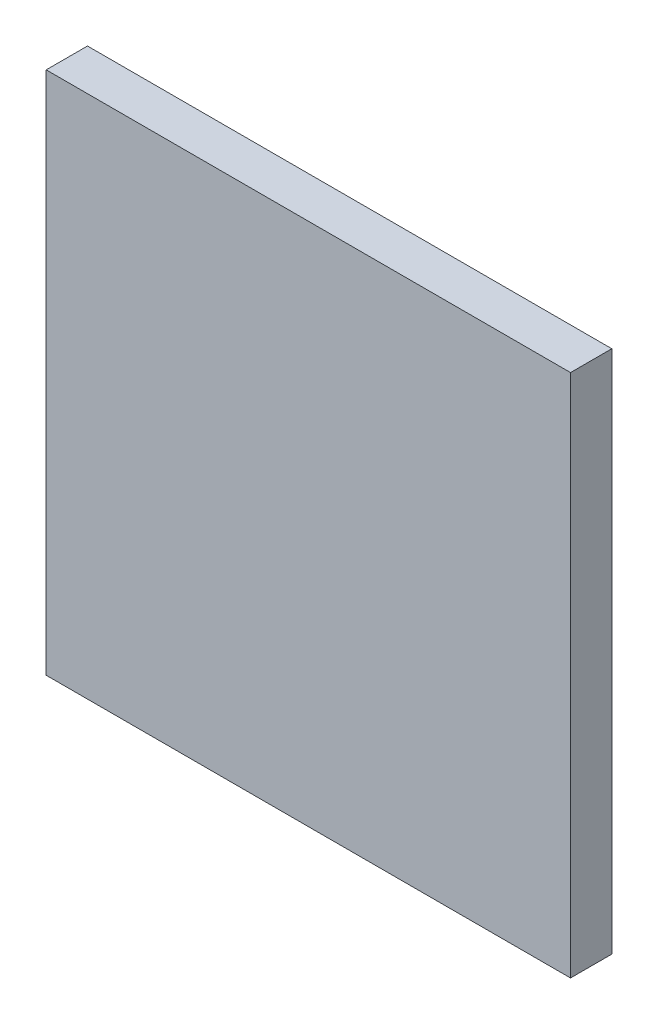
ISO-10303-21;
HEADER;
FILE_DESCRIPTION(('STEP AP214'),'2;1');
FILE_NAME('part.step','',(''),(''),'','','');
FILE_SCHEMA(('AUTOMOTIVE_DESIGN { 1 0 10303 214 1 1 1 1 }'));
ENDSEC;
DATA;
#1=APPLICATION_CONTEXT('core data for automotive mechanical design processes');
#2=APPLICATION_PROTOCOL_DEFINITION('international standard','automotive_design',2000,#1);
#3=PRODUCT_CONTEXT('',#1,'mechanical');
#4=PRODUCT('Part','Part','',(#3));
#5=PRODUCT_RELATED_PRODUCT_CATEGORY('part','',(#4));
#6=PRODUCT_DEFINITION_FORMATION('','',#4);
#7=PRODUCT_DEFINITION_CONTEXT('part definition',#1,'design');
#8=PRODUCT_DEFINITION('design','',#6,#7);
#9=PRODUCT_DEFINITION_SHAPE('','',#8);
#10=(LENGTH_UNIT() NAMED_UNIT(*) SI_UNIT(.MILLI.,.METRE.));
#11=(NAMED_UNIT(*) PLANE_ANGLE_UNIT() SI_UNIT($,.RADIAN.));
#12=(NAMED_UNIT(*) SI_UNIT($,.STERADIAN.) SOLID_ANGLE_UNIT());
#13=UNCERTAINTY_MEASURE_WITH_UNIT(LENGTH_MEASURE(1.E-05),#10,'distance_accuracy_value','');
#14=(GEOMETRIC_REPRESENTATION_CONTEXT(3) GLOBAL_UNCERTAINTY_ASSIGNED_CONTEXT((#13)) GLOBAL_UNIT_ASSIGNED_CONTEXT((#10,
#11,#12)) REPRESENTATION_CONTEXT('',''));
#15=CARTESIAN_POINT('',(0.,0.,0.));
#16=DIRECTION('',(0.,0.,1.));
#17=DIRECTION('',(1.,0.,0.));
#18=AXIS2_PLACEMENT_3D('',#15,#16,#17);
#19=CARTESIAN_POINT('',(0.,0.,4.));
#20=DIRECTION('',(-1.,0.,0.));
#21=DIRECTION('',(0.,-1.,0.));
#22=AXIS2_PLACEMENT_3D('',#19,#20,#21);
#23=PLANE('',#22);
#24=DIRECTION('',(0.,1.,0.));
#25=VECTOR('',#24,1.);
#26=CARTESIAN_POINT('',(0.,0.,0.));
#27=LINE('',#26,#25);
#28=CARTESIAN_POINT('',(0.,0.,0.));
#29=VERTEX_POINT('',#28);
#30=CARTESIAN_POINT('',(0.,50.8,0.));
#31=VERTEX_POINT('',#30);
#32=EDGE_CURVE('E97',#29,#31,#27,.T.);
#33=ORIENTED_EDGE('',*,*,#32,.T.);
#34=DIRECTION('',(0.,0.,-1.));
#35=VECTOR('',#34,1.);
#36=CARTESIAN_POINT('',(0.,50.8,4.));
#37=LINE('',#36,#35);
#38=CARTESIAN_POINT('',(0.,50.8,4.));
#39=VERTEX_POINT('',#38);
#40=EDGE_CURVE('E11',#39,#31,#37,.T.);
#41=ORIENTED_EDGE('',*,*,#40,.F.);
#42=DIRECTION('',(0.,1.,0.));
#43=VECTOR('',#42,1.);
#44=CARTESIAN_POINT('',(0.,0.,4.));
#45=LINE('',#44,#43);
#46=CARTESIAN_POINT('',(0.,0.,4.));
#47=VERTEX_POINT('',#46);
#48=EDGE_CURVE('E83',#47,#39,#45,.T.);
#49=ORIENTED_EDGE('',*,*,#48,.F.);
#50=DIRECTION('',(0.,0.,-1.));
#51=VECTOR('',#50,1.);
#52=CARTESIAN_POINT('',(0.,0.,4.));
#53=LINE('',#52,#51);
#54=EDGE_CURVE('E50',#47,#29,#53,.T.);
#55=ORIENTED_EDGE('',*,*,#54,.T.);
#56=EDGE_LOOP('',(#33,#41,#49,#55));
#57=FACE_BOUND('',#56,.T.);
#58=ADVANCED_FACE('F34',(#57),#23,.F.);
#59=CARTESIAN_POINT('',(0.,50.8,4.));
#60=DIRECTION('',(0.,-1.,0.));
#61=DIRECTION('',(1.,0.,0.));
#62=AXIS2_PLACEMENT_3D('',#59,#60,#61);
#63=PLANE('',#62);
#64=DIRECTION('',(-1.,0.,0.));
#65=VECTOR('',#64,1.);
#66=CARTESIAN_POINT('',(0.,50.8,0.));
#67=LINE('',#66,#65);
#68=CARTESIAN_POINT('',(-50.8,50.8,0.));
#69=VERTEX_POINT('',#68);
#70=EDGE_CURVE('E88',#31,#69,#67,.T.);
#71=ORIENTED_EDGE('',*,*,#70,.T.);
#72=DIRECTION('',(0.,0.,-1.));
#73=VECTOR('',#72,1.);
#74=CARTESIAN_POINT('',(-50.8,50.8,4.));
#75=LINE('',#74,#73);
#76=CARTESIAN_POINT('',(-50.8,50.8,4.));
#77=VERTEX_POINT('',#76);
#78=EDGE_CURVE('E42',#77,#69,#75,.T.);
#79=ORIENTED_EDGE('',*,*,#78,.F.);
#80=DIRECTION('',(-1.,0.,0.));
#81=VECTOR('',#80,1.);
#82=CARTESIAN_POINT('',(0.,50.8,4.));
#83=LINE('',#82,#81);
#84=EDGE_CURVE('E75',#39,#77,#83,.T.);
#85=ORIENTED_EDGE('',*,*,#84,.F.);
#86=ORIENTED_EDGE('',*,*,#40,.T.);
#87=EDGE_LOOP('',(#71,#79,#85,#86));
#88=FACE_BOUND('',#87,.T.);
#89=ADVANCED_FACE('F87',(#88),#63,.F.);
#90=CARTESIAN_POINT('',(-50.8,0.,4.));
#91=DIRECTION('',(-1.,0.,0.));
#92=DIRECTION('',(0.,0.,1.));
#93=AXIS2_PLACEMENT_3D('',#90,#91,#92);
#94=PLANE('',#93);
#95=DIRECTION('',(0.,1.,0.));
#96=VECTOR('',#95,1.);
#97=CARTESIAN_POINT('',(-50.8,0.,0.));
#98=LINE('',#97,#96);
#99=CARTESIAN_POINT('',(-50.8,0.,0.));
#100=VERTEX_POINT('',#99);
#101=EDGE_CURVE('E100',#100,#69,#98,.T.);
#102=ORIENTED_EDGE('',*,*,#101,.F.);
#103=DIRECTION('',(0.,0.,-1.));
#104=VECTOR('',#103,1.);
#105=CARTESIAN_POINT('',(-50.8,0.,4.));
#106=LINE('',#105,#104);
#107=CARTESIAN_POINT('',(-50.8,0.,4.));
#108=VERTEX_POINT('',#107);
#109=EDGE_CURVE('E64',#108,#100,#106,.T.);
#110=ORIENTED_EDGE('',*,*,#109,.F.);
#111=DIRECTION('',(0.,1.,0.));
#112=VECTOR('',#111,1.);
#113=CARTESIAN_POINT('',(-50.8,0.,4.));
#114=LINE('',#113,#112);
#115=EDGE_CURVE('E82',#108,#77,#114,.T.);
#116=ORIENTED_EDGE('',*,*,#115,.T.);
#117=ORIENTED_EDGE('',*,*,#78,.T.);
#118=EDGE_LOOP('',(#102,#110,#116,#117));
#119=FACE_BOUND('',#118,.T.);
#120=ADVANCED_FACE('F91',(#119),#94,.T.);
#121=CARTESIAN_POINT('',(0.,0.,4.));
#122=DIRECTION('',(0.,-1.,0.));
#123=DIRECTION('',(0.,0.,-1.));
#124=AXIS2_PLACEMENT_3D('',#121,#122,#123);
#125=PLANE('',#124);
#126=DIRECTION('',(-1.,0.,0.));
#127=VECTOR('',#126,1.);
#128=CARTESIAN_POINT('',(0.,0.,0.));
#129=LINE('',#128,#127);
#130=EDGE_CURVE('E102',#29,#100,#129,.T.);
#131=ORIENTED_EDGE('',*,*,#130,.F.);
#132=ORIENTED_EDGE('',*,*,#54,.F.);
#133=DIRECTION('',(-1.,0.,0.));
#134=VECTOR('',#133,1.);
#135=CARTESIAN_POINT('',(0.,0.,4.));
#136=LINE('',#135,#134);
#137=EDGE_CURVE('E92',#47,#108,#136,.T.);
#138=ORIENTED_EDGE('',*,*,#137,.T.);
#139=ORIENTED_EDGE('',*,*,#109,.T.);
#140=EDGE_LOOP('',(#131,#132,#138,#139));
#141=FACE_BOUND('',#140,.T.);
#142=ADVANCED_FACE('F108',(#141),#125,.T.);
#143=CARTESIAN_POINT('',(0.,0.,4.));
#144=DIRECTION('',(0.,0.,1.));
#145=DIRECTION('',(1.,0.,0.));
#146=AXIS2_PLACEMENT_3D('',#143,#144,#145);
#147=PLANE('',#146);
#148=ORIENTED_EDGE('',*,*,#48,.T.);
#149=ORIENTED_EDGE('',*,*,#84,.T.);
#150=ORIENTED_EDGE('',*,*,#115,.F.);
#151=ORIENTED_EDGE('',*,*,#137,.F.);
#152=EDGE_LOOP('',(#148,#149,#150,#151));
#153=FACE_BOUND('',#152,.T.);
#154=ADVANCED_FACE('F79',(#153),#147,.T.);
#155=CARTESIAN_POINT('',(0.,0.,0.));
#156=DIRECTION('',(0.,0.,1.));
#157=DIRECTION('',(1.,0.,0.));
#158=AXIS2_PLACEMENT_3D('',#155,#156,#157);
#159=PLANE('',#158);
#160=ORIENTED_EDGE('',*,*,#32,.F.);
#161=ORIENTED_EDGE('',*,*,#130,.T.);
#162=ORIENTED_EDGE('',*,*,#101,.T.);
#163=ORIENTED_EDGE('',*,*,#70,.F.);
#164=EDGE_LOOP('',(#160,#161,#162,#163));
#165=FACE_BOUND('',#164,.T.);
#166=ADVANCED_FACE('F107',(#165),#159,.F.);
#167=CLOSED_SHELL('',(#58,#89,#120,#142,#154,#166));
#168=MANIFOLD_SOLID_BREP('B2',#167);
#169=ADVANCED_BREP_SHAPE_REPRESENTATION('',(#18,#168),#14);
#170=SHAPE_DEFINITION_REPRESENTATION(#9,#169);
ENDSEC;
END-ISO-10303-21;
